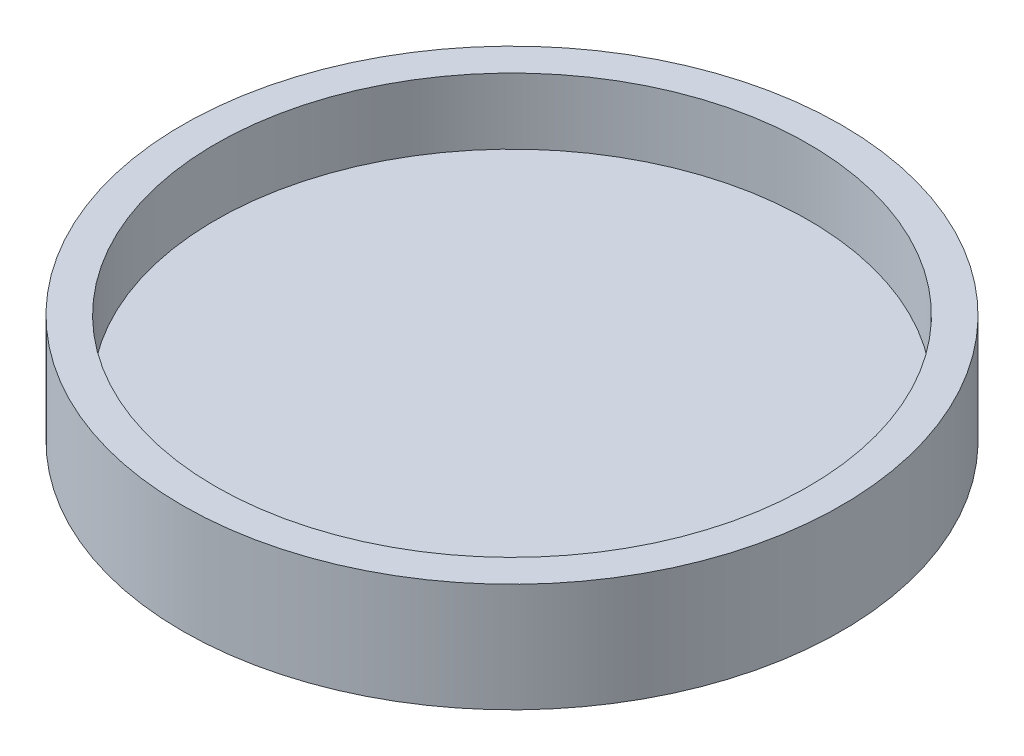
ISO-10303-21;
HEADER;
FILE_DESCRIPTION(('STEP AP214'),'2;1');
FILE_NAME('part.step','',(''),(''),'','','');
FILE_SCHEMA(('AUTOMOTIVE_DESIGN { 1 0 10303 214 1 1 1 1 }'));
ENDSEC;
DATA;
#1=APPLICATION_CONTEXT('core data for automotive mechanical design processes');
#2=APPLICATION_PROTOCOL_DEFINITION('international standard','automotive_design',2000,#1);
#3=PRODUCT_CONTEXT('',#1,'mechanical');
#4=PRODUCT('Part','Part','',(#3));
#5=PRODUCT_RELATED_PRODUCT_CATEGORY('part','',(#4));
#6=PRODUCT_DEFINITION_FORMATION('','',#4);
#7=PRODUCT_DEFINITION_CONTEXT('part definition',#1,'design');
#8=PRODUCT_DEFINITION('design','',#6,#7);
#9=PRODUCT_DEFINITION_SHAPE('','',#8);
#10=(LENGTH_UNIT() NAMED_UNIT(*) SI_UNIT(.MILLI.,.METRE.));
#11=(NAMED_UNIT(*) PLANE_ANGLE_UNIT() SI_UNIT($,.RADIAN.));
#12=(NAMED_UNIT(*) SI_UNIT($,.STERADIAN.) SOLID_ANGLE_UNIT());
#13=UNCERTAINTY_MEASURE_WITH_UNIT(LENGTH_MEASURE(1.E-05),#10,'distance_accuracy_value','');
#14=(GEOMETRIC_REPRESENTATION_CONTEXT(3) GLOBAL_UNCERTAINTY_ASSIGNED_CONTEXT((#13)) GLOBAL_UNIT_ASSIGNED_CONTEXT((#10,
#11,#12)) REPRESENTATION_CONTEXT('',''));
#15=CARTESIAN_POINT('',(0.,0.,0.));
#16=DIRECTION('',(0.,0.,1.));
#17=DIRECTION('',(1.,0.,0.));
#18=AXIS2_PLACEMENT_3D('',#15,#16,#17);
#19=CARTESIAN_POINT('',(0.,3.3,0.));
#20=DIRECTION('',(0.,-1.,0.));
#21=DIRECTION('',(0.,0.,-1.));
#22=AXIS2_PLACEMENT_3D('',#19,#20,#21);
#23=CYLINDRICAL_SURFACE('',#22,10.);
#24=CARTESIAN_POINT('',(0.,3.3,0.));
#25=DIRECTION('',(0.,1.,0.));
#26=DIRECTION('',(0.,0.,1.));
#27=AXIS2_PLACEMENT_3D('',#24,#25,#26);
#28=CIRCLE('',#27,10.);
#29=CARTESIAN_POINT('',(0.,3.3,10.));
#30=VERTEX_POINT('',#29);
#31=EDGE_CURVE('E10',#30,#30,#28,.T.);
#32=ORIENTED_EDGE('',*,*,#31,.F.);
#33=EDGE_LOOP('',(#32));
#34=FACE_BOUND('',#33,.T.);
#35=CARTESIAN_POINT('',(0.,0.,0.));
#36=DIRECTION('',(0.,1.,0.));
#37=DIRECTION('',(0.,0.,1.));
#38=AXIS2_PLACEMENT_3D('',#35,#36,#37);
#39=CIRCLE('',#38,10.);
#40=CARTESIAN_POINT('',(0.,0.,10.));
#41=VERTEX_POINT('',#40);
#42=EDGE_CURVE('E36',#41,#41,#39,.T.);
#43=ORIENTED_EDGE('',*,*,#42,.T.);
#44=EDGE_LOOP('',(#43));
#45=FACE_BOUND('',#44,.T.);
#46=ADVANCED_FACE('F33',(#34,#45),#23,.T.);
#47=CARTESIAN_POINT('',(0.,3.3,0.));
#48=DIRECTION('',(0.,1.,0.));
#49=DIRECTION('',(0.,0.,1.));
#50=AXIS2_PLACEMENT_3D('',#47,#48,#49);
#51=PLANE('',#50);
#52=CARTESIAN_POINT('',(0.,3.3,0.));
#53=DIRECTION('',(0.,1.,0.));
#54=DIRECTION('',(0.,0.,1.));
#55=AXIS2_PLACEMENT_3D('',#52,#53,#54);
#56=CIRCLE('',#55,9.);
#57=CARTESIAN_POINT('',(0.,3.3,9.));
#58=VERTEX_POINT('',#57);
#59=EDGE_CURVE('E45',#58,#58,#56,.T.);
#60=ORIENTED_EDGE('',*,*,#59,.F.);
#61=EDGE_LOOP('',(#60));
#62=FACE_BOUND('',#61,.T.);
#63=ORIENTED_EDGE('',*,*,#31,.T.);
#64=EDGE_LOOP('',(#63));
#65=FACE_BOUND('',#64,.T.);
#66=ADVANCED_FACE('F70',(#62,#65),#51,.T.);
#67=CARTESIAN_POINT('',(0.,0.,0.));
#68=DIRECTION('',(0.,1.,0.));
#69=DIRECTION('',(0.,0.,1.));
#70=AXIS2_PLACEMENT_3D('',#67,#68,#69);
#71=PLANE('',#70);
#72=CARTESIAN_POINT('',(0.,0.,0.));
#73=DIRECTION('',(0.,-1.,0.));
#74=DIRECTION('',(0.,0.,-1.));
#75=AXIS2_PLACEMENT_3D('',#72,#73,#74);
#76=CIRCLE('',#75,2.5);
#77=CARTESIAN_POINT('',(0.,0.,-2.5));
#78=VERTEX_POINT('',#77);
#79=EDGE_CURVE('E51',#78,#78,#76,.T.);
#80=ORIENTED_EDGE('',*,*,#79,.F.);
#81=EDGE_LOOP('',(#80));
#82=FACE_BOUND('',#81,.T.);
#83=ORIENTED_EDGE('',*,*,#42,.F.);
#84=EDGE_LOOP('',(#83));
#85=FACE_BOUND('',#84,.T.);
#86=ADVANCED_FACE('F66',(#82,#85),#71,.F.);
#87=CARTESIAN_POINT('',(0.,1.3,0.));
#88=DIRECTION('',(0.,1.,0.));
#89=DIRECTION('',(0.,0.,1.));
#90=AXIS2_PLACEMENT_3D('',#87,#88,#89);
#91=CYLINDRICAL_SURFACE('',#90,9.);
#92=CARTESIAN_POINT('',(0.,1.3,0.));
#93=DIRECTION('',(0.,1.,0.));
#94=DIRECTION('',(0.,0.,1.));
#95=AXIS2_PLACEMENT_3D('',#92,#93,#94);
#96=CIRCLE('',#95,9.);
#97=CARTESIAN_POINT('',(0.,1.3,9.));
#98=VERTEX_POINT('',#97);
#99=EDGE_CURVE('E43',#98,#98,#96,.T.);
#100=ORIENTED_EDGE('',*,*,#99,.F.);
#101=EDGE_LOOP('',(#100));
#102=FACE_BOUND('',#101,.T.);
#103=ORIENTED_EDGE('',*,*,#59,.T.);
#104=EDGE_LOOP('',(#103));
#105=FACE_BOUND('',#104,.T.);
#106=ADVANCED_FACE('F69',(#102,#105),#91,.F.);
#107=CARTESIAN_POINT('',(0.,1.3,0.));
#108=DIRECTION('',(0.,1.,0.));
#109=DIRECTION('',(0.,0.,1.));
#110=AXIS2_PLACEMENT_3D('',#107,#108,#109);
#111=PLANE('',#110);
#112=ORIENTED_EDGE('',*,*,#99,.T.);
#113=EDGE_LOOP('',(#112));
#114=FACE_BOUND('',#113,.T.);
#115=ADVANCED_FACE('F62',(#114),#111,.T.);
#116=CARTESIAN_POINT('',(0.,0.8,0.));
#117=DIRECTION('',(0.,-1.,0.));
#118=DIRECTION('',(0.,0.,-1.));
#119=AXIS2_PLACEMENT_3D('',#116,#117,#118);
#120=CYLINDRICAL_SURFACE('',#119,2.5);
#121=CARTESIAN_POINT('',(0.,0.8,0.));
#122=DIRECTION('',(0.,-1.,0.));
#123=DIRECTION('',(0.,0.,-1.));
#124=AXIS2_PLACEMENT_3D('',#121,#122,#123);
#125=CIRCLE('',#124,2.5);
#126=CARTESIAN_POINT('',(0.,0.8,-2.5));
#127=VERTEX_POINT('',#126);
#128=EDGE_CURVE('E48',#127,#127,#125,.T.);
#129=ORIENTED_EDGE('',*,*,#128,.F.);
#130=EDGE_LOOP('',(#129));
#131=FACE_BOUND('',#130,.T.);
#132=ORIENTED_EDGE('',*,*,#79,.T.);
#133=EDGE_LOOP('',(#132));
#134=FACE_BOUND('',#133,.T.);
#135=ADVANCED_FACE('F59',(#131,#134),#120,.F.);
#136=CARTESIAN_POINT('',(0.,0.8,0.));
#137=DIRECTION('',(0.,-1.,0.));
#138=DIRECTION('',(0.,0.,-1.));
#139=AXIS2_PLACEMENT_3D('',#136,#137,#138);
#140=PLANE('',#139);
#141=ORIENTED_EDGE('',*,*,#128,.T.);
#142=EDGE_LOOP('',(#141));
#143=FACE_BOUND('',#142,.T.);
#144=ADVANCED_FACE('F57',(#143),#140,.T.);
#145=CLOSED_SHELL('',(#46,#66,#86,#106,#115,#135,#144));
#146=MANIFOLD_SOLID_BREP('B2',#145);
#147=ADVANCED_BREP_SHAPE_REPRESENTATION('',(#18,#146),#14);
#148=SHAPE_DEFINITION_REPRESENTATION(#9,#147);
ENDSEC;
END-ISO-10303-21;
